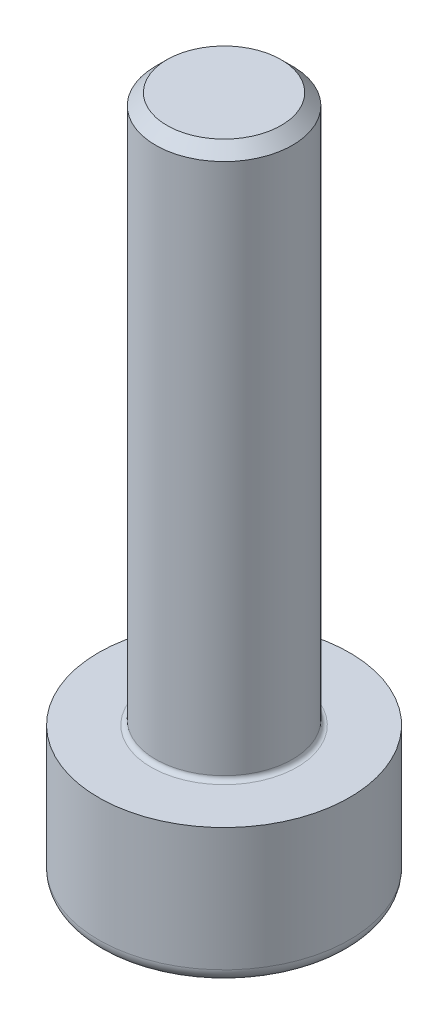
ISO-10303-21;
HEADER;
FILE_DESCRIPTION(('STEP AP214'),'2;1');
FILE_NAME('part.step','',(''),(''),'','','');
FILE_SCHEMA(('AUTOMOTIVE_DESIGN { 1 0 10303 214 1 1 1 1 }'));
ENDSEC;
DATA;
#1=APPLICATION_CONTEXT('core data for automotive mechanical design processes');
#2=APPLICATION_PROTOCOL_DEFINITION('international standard','automotive_design',2000,#1);
#3=PRODUCT_CONTEXT('',#1,'mechanical');
#4=PRODUCT('Part','Part','',(#3));
#5=PRODUCT_RELATED_PRODUCT_CATEGORY('part','',(#4));
#6=PRODUCT_DEFINITION_FORMATION('','',#4);
#7=PRODUCT_DEFINITION_CONTEXT('part definition',#1,'design');
#8=PRODUCT_DEFINITION('design','',#6,#7);
#9=PRODUCT_DEFINITION_SHAPE('','',#8);
#10=(LENGTH_UNIT() NAMED_UNIT(*) SI_UNIT(.MILLI.,.METRE.));
#11=(NAMED_UNIT(*) PLANE_ANGLE_UNIT() SI_UNIT($,.RADIAN.));
#12=(NAMED_UNIT(*) SI_UNIT($,.STERADIAN.) SOLID_ANGLE_UNIT());
#13=UNCERTAINTY_MEASURE_WITH_UNIT(LENGTH_MEASURE(1.E-05),#10,'distance_accuracy_value','');
#14=(GEOMETRIC_REPRESENTATION_CONTEXT(3) GLOBAL_UNCERTAINTY_ASSIGNED_CONTEXT((#13)) GLOBAL_UNIT_ASSIGNED_CONTEXT((#10,
#11,#12)) REPRESENTATION_CONTEXT('',''));
#15=CARTESIAN_POINT('',(0.,0.,0.));
#16=DIRECTION('',(0.,0.,1.));
#17=DIRECTION('',(1.,0.,0.));
#18=AXIS2_PLACEMENT_3D('',#15,#16,#17);
#19=CARTESIAN_POINT('',(2.45,0.,0.));
#20=DIRECTION('',(0.,1.,0.));
#21=DIRECTION('',(-1.,0.,0.));
#22=AXIS2_PLACEMENT_3D('',#19,#20,#21);
#23=PLANE('',#22);
#24=CARTESIAN_POINT('',(0.,0.,0.));
#25=DIRECTION('',(0.,-1.,0.));
#26=DIRECTION('',(-1.,0.,0.));
#27=AXIS2_PLACEMENT_3D('',#24,#25,#26);
#28=CIRCLE('',#27,2.45);
#29=CARTESIAN_POINT('',(-2.45,0.,0.));
#30=VERTEX_POINT('',#29);
#31=EDGE_CURVE('E175',#30,#30,#28,.T.);
#32=ORIENTED_EDGE('',*,*,#31,.T.);
#33=EDGE_LOOP('',(#32));
#34=FACE_BOUND('',#33,.T.);
#35=DIRECTION('',(0.,0.,-1.));
#36=VECTOR('',#35,1.);
#37=CARTESIAN_POINT('',(-1.25,0.,0.));
#38=LINE('',#37,#36);
#39=CARTESIAN_POINT('',(-1.25,0.,0.721687836487033));
#40=VERTEX_POINT('',#39);
#41=CARTESIAN_POINT('',(-1.25,0.,-0.721687836487033));
#42=VERTEX_POINT('',#41);
#43=EDGE_CURVE('E180',#40,#42,#38,.T.);
#44=ORIENTED_EDGE('',*,*,#43,.F.);
#45=DIRECTION('',(-0.866025403784439,0.,-0.5));
#46=VECTOR('',#45,1.);
#47=CARTESIAN_POINT('',(1.2125,0.,2.14341287436649));
#48=LINE('',#47,#46);
#49=CARTESIAN_POINT('',(0.,0.,1.44337567297407));
#50=VERTEX_POINT('',#49);
#51=EDGE_CURVE('E182',#50,#40,#48,.T.);
#52=ORIENTED_EDGE('',*,*,#51,.F.);
#53=DIRECTION('',(-0.866025403784439,0.,0.5));
#54=VECTOR('',#53,1.);
#55=CARTESIAN_POINT('',(2.4625,0.,0.0216506350946127));
#56=LINE('',#55,#54);
#57=CARTESIAN_POINT('',(1.25,0.,0.721687836487034));
#58=VERTEX_POINT('',#57);
#59=EDGE_CURVE('E190',#58,#50,#56,.T.);
#60=ORIENTED_EDGE('',*,*,#59,.F.);
#61=DIRECTION('',(0.,0.,1.));
#62=VECTOR('',#61,1.);
#63=CARTESIAN_POINT('',(1.25,0.,0.));
#64=LINE('',#63,#62);
#65=CARTESIAN_POINT('',(1.25,0.,-0.721687836487033));
#66=VERTEX_POINT('',#65);
#67=EDGE_CURVE('E185',#66,#58,#64,.T.);
#68=ORIENTED_EDGE('',*,*,#67,.F.);
#69=DIRECTION('',(0.866025403784439,0.,0.5));
#70=VECTOR('',#69,1.);
#71=CARTESIAN_POINT('',(2.4625,0.,-0.021650635094612));
#72=LINE('',#71,#70);
#73=CARTESIAN_POINT('',(0.,0.,-1.44337567297407));
#74=VERTEX_POINT('',#73);
#75=EDGE_CURVE('E53',#74,#66,#72,.T.);
#76=ORIENTED_EDGE('',*,*,#75,.F.);
#77=DIRECTION('',(0.866025403784439,0.,-0.5));
#78=VECTOR('',#77,1.);
#79=CARTESIAN_POINT('',(1.2125,0.,-2.14341287436649));
#80=LINE('',#79,#78);
#81=EDGE_CURVE('E11',#42,#74,#80,.T.);
#82=ORIENTED_EDGE('',*,*,#81,.F.);
#83=EDGE_LOOP('',(#44,#52,#60,#68,#76,#82));
#84=FACE_BOUND('',#83,.T.);
#85=ADVANCED_FACE('F44',(#34,#84),#23,.F.);
#86=CARTESIAN_POINT('',(0.,0.3,0.));
#87=DIRECTION('',(0.,1.,0.));
#88=DIRECTION('',(-1.,0.,0.));
#89=AXIS2_PLACEMENT_3D('',#86,#87,#88);
#90=TOROIDAL_SURFACE('',#89,2.45,0.3);
#91=CARTESIAN_POINT('',(0.,0.3,0.));
#92=DIRECTION('',(0.,-1.,0.));
#93=DIRECTION('',(-1.,0.,0.));
#94=AXIS2_PLACEMENT_3D('',#91,#92,#93);
#95=CIRCLE('',#94,2.75);
#96=CARTESIAN_POINT('',(-2.75,0.3,0.));
#97=VERTEX_POINT('',#96);
#98=EDGE_CURVE('E193',#97,#97,#95,.T.);
#99=ORIENTED_EDGE('',*,*,#98,.T.);
#100=EDGE_LOOP('',(#99));
#101=FACE_BOUND('',#100,.T.);
#102=ORIENTED_EDGE('',*,*,#31,.F.);
#103=EDGE_LOOP('',(#102));
#104=FACE_BOUND('',#103,.T.);
#105=ADVANCED_FACE('F164',(#101,#104),#90,.T.);
#106=CARTESIAN_POINT('',(0.,2.57168783648703,0.));
#107=DIRECTION('',(0.,1.,0.));
#108=DIRECTION('',(-1.,0.,0.));
#109=AXIS2_PLACEMENT_3D('',#106,#107,#108);
#110=CYLINDRICAL_SURFACE('',#109,2.75);
#111=CARTESIAN_POINT('',(0.,3.,0.));
#112=DIRECTION('',(0.,-1.,0.));
#113=DIRECTION('',(-1.,0.,0.));
#114=AXIS2_PLACEMENT_3D('',#111,#112,#113);
#115=CIRCLE('',#114,2.75);
#116=CARTESIAN_POINT('',(-2.75,3.,0.));
#117=VERTEX_POINT('',#116);
#118=EDGE_CURVE('E196',#117,#117,#115,.T.);
#119=ORIENTED_EDGE('',*,*,#118,.T.);
#120=EDGE_LOOP('',(#119));
#121=FACE_BOUND('',#120,.T.);
#122=ORIENTED_EDGE('',*,*,#98,.F.);
#123=EDGE_LOOP('',(#122));
#124=FACE_BOUND('',#123,.T.);
#125=ADVANCED_FACE('F160',(#121,#124),#110,.T.);
#126=CARTESIAN_POINT('',(1.6,3.,0.));
#127=DIRECTION('',(0.,-1.,0.));
#128=DIRECTION('',(1.,0.,0.));
#129=AXIS2_PLACEMENT_3D('',#126,#127,#128);
#130=PLANE('',#129);
#131=CARTESIAN_POINT('',(0.,3.,0.));
#132=DIRECTION('',(0.,-1.,0.));
#133=DIRECTION('',(-1.,0.,0.));
#134=AXIS2_PLACEMENT_3D('',#131,#132,#133);
#135=CIRCLE('',#134,1.6);
#136=CARTESIAN_POINT('',(-1.6,3.,0.));
#137=VERTEX_POINT('',#136);
#138=EDGE_CURVE('E199',#137,#137,#135,.T.);
#139=ORIENTED_EDGE('',*,*,#138,.T.);
#140=EDGE_LOOP('',(#139));
#141=FACE_BOUND('',#140,.T.);
#142=ORIENTED_EDGE('',*,*,#118,.F.);
#143=EDGE_LOOP('',(#142));
#144=FACE_BOUND('',#143,.T.);
#145=ADVANCED_FACE('F156',(#141,#144),#130,.F.);
#146=CARTESIAN_POINT('',(0.,3.1,0.));
#147=DIRECTION('',(0.,1.,0.));
#148=DIRECTION('',(-1.,0.,0.));
#149=AXIS2_PLACEMENT_3D('',#146,#147,#148);
#150=TOROIDAL_SURFACE('',#149,1.6,0.099999999999999);
#151=CARTESIAN_POINT('',(0.,3.1,0.));
#152=DIRECTION('',(0.,-1.,0.));
#153=DIRECTION('',(-1.,0.,0.));
#154=AXIS2_PLACEMENT_3D('',#151,#152,#153);
#155=CIRCLE('',#154,1.5);
#156=CARTESIAN_POINT('',(-1.5,3.1,0.));
#157=VERTEX_POINT('',#156);
#158=EDGE_CURVE('E202',#157,#157,#155,.T.);
#159=ORIENTED_EDGE('',*,*,#158,.T.);
#160=EDGE_LOOP('',(#159));
#161=FACE_BOUND('',#160,.T.);
#162=ORIENTED_EDGE('',*,*,#138,.F.);
#163=EDGE_LOOP('',(#162));
#164=FACE_BOUND('',#163,.T.);
#165=ADVANCED_FACE('F152',(#161,#164),#150,.F.);
#166=CARTESIAN_POINT('',(0.,2.57168783648703,0.));
#167=DIRECTION('',(0.,1.,0.));
#168=DIRECTION('',(-1.,0.,0.));
#169=AXIS2_PLACEMENT_3D('',#166,#167,#168);
#170=CYLINDRICAL_SURFACE('',#169,1.5);
#171=CARTESIAN_POINT('',(0.,14.75,0.));
#172=DIRECTION('',(0.,-1.,0.));
#173=DIRECTION('',(-1.,0.,0.));
#174=AXIS2_PLACEMENT_3D('',#171,#172,#173);
#175=CIRCLE('',#174,1.5);
#176=CARTESIAN_POINT('',(-1.5,14.75,0.));
#177=VERTEX_POINT('',#176);
#178=EDGE_CURVE('E205',#177,#177,#175,.T.);
#179=ORIENTED_EDGE('',*,*,#178,.T.);
#180=EDGE_LOOP('',(#179));
#181=FACE_BOUND('',#180,.T.);
#182=ORIENTED_EDGE('',*,*,#158,.F.);
#183=EDGE_LOOP('',(#182));
#184=FACE_BOUND('',#183,.T.);
#185=ADVANCED_FACE('F148',(#181,#184),#170,.T.);
#186=CARTESIAN_POINT('',(0.,14.75,0.));
#187=DIRECTION('',(0.,-1.,0.));
#188=DIRECTION('',(1.,0.,0.));
#189=AXIS2_PLACEMENT_3D('',#186,#187,#188);
#190=CONICAL_SURFACE('',#189,1.5,0.785398163397447);
#191=CARTESIAN_POINT('',(0.,15.,0.));
#192=DIRECTION('',(0.,-1.,0.));
#193=DIRECTION('',(-1.,0.,0.));
#194=AXIS2_PLACEMENT_3D('',#191,#192,#193);
#195=CIRCLE('',#194,1.25);
#196=CARTESIAN_POINT('',(-1.25,15.,0.));
#197=VERTEX_POINT('',#196);
#198=EDGE_CURVE('E208',#197,#197,#195,.T.);
#199=ORIENTED_EDGE('',*,*,#198,.T.);
#200=EDGE_LOOP('',(#199));
#201=FACE_BOUND('',#200,.T.);
#202=ORIENTED_EDGE('',*,*,#178,.F.);
#203=EDGE_LOOP('',(#202));
#204=FACE_BOUND('',#203,.T.);
#205=ADVANCED_FACE('F144',(#201,#204),#190,.T.);
#206=CARTESIAN_POINT('',(0.,15.,0.));
#207=DIRECTION('',(0.,-1.,0.));
#208=DIRECTION('',(1.,0.,0.));
#209=AXIS2_PLACEMENT_3D('',#206,#207,#208);
#210=PLANE('',#209);
#211=ORIENTED_EDGE('',*,*,#198,.F.);
#212=EDGE_LOOP('',(#211));
#213=FACE_BOUND('',#212,.T.);
#214=ADVANCED_FACE('F139',(#213),#210,.F.);
#215=CARTESIAN_POINT('',(1.25,15.001,0.721687836487034));
#216=DIRECTION('',(1.,0.,0.));
#217=DIRECTION('',(0.,0.,1.));
#218=AXIS2_PLACEMENT_3D('',#215,#216,#217);
#219=PLANE('',#218);
#220=CARTESIAN_POINT('',(1.25,1.22644580862981,1.96634898747406));
#221=CARTESIAN_POINT('',(1.25,1.25317146219852,1.91148378854413));
#222=CARTESIAN_POINT('',(1.25,1.2796480285554,1.85649545080559));
#223=CARTESIAN_POINT('',(1.25,1.3319649674294,1.7462072516911));
#224=CARTESIAN_POINT('',(1.25,1.35780524459231,1.69090734513106));
#225=CARTESIAN_POINT('',(1.25,1.4088355139196,1.57965936326713));
#226=CARTESIAN_POINT('',(1.25,1.43402143890061,1.52370941384165));
#227=CARTESIAN_POINT('',(1.25,1.48339304136398,1.41137315660425));
#228=CARTESIAN_POINT('',(1.25,1.50757876450185,1.35498686884934));
#229=CARTESIAN_POINT('',(1.25,1.57982512890039,1.18132779523945));
#230=CARTESIAN_POINT('',(1.25,1.62586428184677,1.06320038599232));
#231=CARTESIAN_POINT('',(1.25,1.70906475040286,0.823976834049391));
#232=CARTESIAN_POINT('',(1.25,1.7462456223794,0.70288789412274));
#233=CARTESIAN_POINT('',(1.25,1.79094524453186,0.51886755493118));
#234=CARTESIAN_POINT('',(1.25,1.80398004287685,0.457294016373166));
#235=CARTESIAN_POINT('',(1.25,1.82555714754675,0.333351830610552));
#236=CARTESIAN_POINT('',(1.25,1.83409998794023,0.27098327883208));
#237=CARTESIAN_POINT('',(1.25,1.84590477816891,0.146586081476386));
#238=CARTESIAN_POINT('',(1.25,1.84923660926268,0.084564252788793));
#239=CARTESIAN_POINT('',(1.25,1.85052929618531,-0.0395366710055276));
#240=CARTESIAN_POINT('',(1.25,1.84848992817905,-0.101615768391054));
#241=CARTESIAN_POINT('',(1.25,1.83745961567824,-0.248814169138213));
#242=CARTESIAN_POINT('',(1.25,1.82612933862852,-0.33375915810721));
#243=CARTESIAN_POINT('',(1.25,1.7953184933172,-0.502179342148273));
#244=CARTESIAN_POINT('',(1.25,1.77582917687708,-0.585652859086516));
#245=CARTESIAN_POINT('',(1.25,1.74180711198623,-0.710631739553223));
#246=CARTESIAN_POINT('',(1.25,1.72948747231231,-0.752765091259072));
#247=CARTESIAN_POINT('',(1.25,1.70352113916922,-0.83659530045168));
#248=CARTESIAN_POINT('',(1.25,1.6898752262336,-0.878292398865865));
#249=CARTESIAN_POINT('',(1.25,1.66147120615486,-0.961301686065083));
#250=CARTESIAN_POINT('',(1.25,1.64671313334558,-1.00261388668821));
#251=CARTESIAN_POINT('',(1.25,1.61626323194121,-1.08489771065719));
#252=CARTESIAN_POINT('',(1.25,1.60057127765747,-1.12586928730981));
#253=CARTESIAN_POINT('',(1.25,1.54674137764618,-1.26252996281167));
#254=CARTESIAN_POINT('',(1.25,1.50685907587367,-1.35753167600178));
#255=CARTESIAN_POINT('',(1.25,1.4242597796916,-1.54630039074075));
#256=CARTESIAN_POINT('',(1.25,1.38154213370329,-1.64006710250442));
#257=CARTESIAN_POINT('',(1.25,1.29412743576656,-1.8267354934722));
#258=CARTESIAN_POINT('',(1.25,1.24942925990683,-1.91963664434324));
#259=CARTESIAN_POINT('',(1.25,1.1586378419371,-2.10475634551476));
#260=CARTESIAN_POINT('',(1.25,1.11254453900757,-2.19697486583774));
#261=CARTESIAN_POINT('',(1.25,0.97253920737547,-2.47330326122855));
#262=CARTESIAN_POINT('',(1.25,0.877113426737367,-2.65664454094219));
#263=CARTESIAN_POINT('',(1.25,0.684015252311146,-3.02204198462106));
#264=CARTESIAN_POINT('',(1.25,0.586343711538339,-3.20409860329431));
#265=CARTESIAN_POINT('',(1.25,0.40393555500273,-3.54087867644216));
#266=CARTESIAN_POINT('',(1.25,0.319394691562984,-3.69570826723714));
#267=CARTESIAN_POINT('',(1.25,0.149562599723357,-4.00497752173039));
#268=CARTESIAN_POINT('',(1.25,0.064271287544673,-4.1594171393509));
#269=CARTESIAN_POINT('',(1.25,-0.106473142461991,-4.4673228515578));
#270=CARTESIAN_POINT('',(1.25,-0.191923915614537,-4.62079024746718));
#271=CARTESIAN_POINT('',(1.25,-0.363221852324531,-4.92747869775711));
#272=CARTESIAN_POINT('',(1.25,-0.449068965280437,-5.08069978039172));
#273=CARTESIAN_POINT('',(1.25,-0.535057170488759,-5.23384119123874));
#274=B_SPLINE_CURVE_WITH_KNOTS('',3,(#220,#221,#222,#223,#224,#225,#226,#227,#228,#229,#230,
#231,#232,#233,#234,#235,#236,#237,#238,#239,#240,#241,#242,#243,#244,#245,#246,#247,#248,#249,
#250,#251,#252,#253,#254,#255,#256,#257,#258,#259,#260,#261,#262,#263,#264,#265,#266,#267,#268,
#269,#270,#271,#272,#273),.UNSPECIFIED.,.F.,.F.,(4,2,2,2,2,2,2,2,2,2,2,2,2,2,2,2,2,2,2,2,2,2,2,
2,2,2,4),(0.,0.183086522072901,0.366200316511046,0.550263707495385,0.734318687373647,
1.11450020043434,1.49383444626733,1.682515563593,1.87117424271846,2.05728056906829,
2.2433946511888,2.49996410929789,2.75680937038745,2.88848504146508,3.02008368316105,
3.15167826389845,3.28329059583557,3.59230924344663,3.90139915289052,4.2106667692432,
4.51994788735812,5.13997840471392,5.75977718199721,6.28899455758078,6.81827178326328,
7.34523094703629,7.87212459722161),.UNSPECIFIED.);
#275=CARTESIAN_POINT('',(1.25,1.73835450315374,0.721687836487098));
#276=VERTEX_POINT('',#275);
#277=CARTESIAN_POINT('',(1.25,1.7383545031537,-0.721687836487033));
#278=VERTEX_POINT('',#277);
#279=EDGE_CURVE('E103',#276,#278,#274,.T.);
#280=ORIENTED_EDGE('',*,*,#279,.T.);
#281=DIRECTION('',(0.,-1.,0.));
#282=VECTOR('',#281,1.);
#283=CARTESIAN_POINT('',(1.25,15.001,-0.721687836487033));
#284=LINE('',#283,#282);
#285=EDGE_CURVE('E109',#278,#66,#284,.T.);
#286=ORIENTED_EDGE('',*,*,#285,.T.);
#287=ORIENTED_EDGE('',*,*,#67,.T.);
#288=DIRECTION('',(0.,-1.,0.));
#289=VECTOR('',#288,1.);
#290=CARTESIAN_POINT('',(1.25,15.001,0.721687836487034));
#291=LINE('',#290,#289);
#292=EDGE_CURVE('E120',#276,#58,#291,.T.);
#293=ORIENTED_EDGE('',*,*,#292,.F.);
#294=EDGE_LOOP('',(#280,#286,#287,#293));
#295=FACE_BOUND('',#294,.T.);
#296=ADVANCED_FACE('F119',(#295),#219,.F.);
#297=CARTESIAN_POINT('',(1.25,15.001,-0.721687836487033));
#298=DIRECTION('',(0.5,0.,-0.866025403784438));
#299=DIRECTION('',(0.866025403784439,0.,0.5));
#300=AXIS2_PLACEMENT_3D('',#297,#298,#299);
#301=PLANE('',#300);
#302=CARTESIAN_POINT('',(1.2502,1.73828782848767,-0.721572366433196));
#303=CARTESIAN_POINT('',(1.19526669476824,1.75660858839001,-0.753288124996231));
#304=CARTESIAN_POINT('',(1.13985921349976,1.77327119695306,-0.785277649221704));
#305=CARTESIAN_POINT('',(1.02808463239966,1.80235719920793,-0.849810733708405));
#306=CARTESIAN_POINT('',(0.97171554515829,1.81477030117765,-0.882355441401183));
#307=CARTESIAN_POINT('',(0.859676025913016,1.83409481551769,-0.947041487997319));
#308=CARTESIAN_POINT('',(0.804022841540771,1.84113481370627,-0.979172868975894));
#309=CARTESIAN_POINT('',(0.692454346091609,1.84954207052307,-1.04358696985655));
#310=CARTESIAN_POINT('',(0.6365394410624,1.85091628794897,-1.07586945532688));
#311=CARTESIAN_POINT('',(0.532042078818275,1.84807116578578,-1.13620103554813));
#312=CARTESIAN_POINT('',(0.483444050118685,1.84455040433368,-1.16425912049992));
#313=CARTESIAN_POINT('',(0.386564637826762,1.83338739045444,-1.22019247526559));
#314=CARTESIAN_POINT('',(0.338283589807837,1.82574131758102,-1.24806755133608));
#315=CARTESIAN_POINT('',(0.241204116145957,1.80662504845317,-1.30411641158755));
#316=CARTESIAN_POINT('',(0.192417989648101,1.79507374617404,-1.33228309485381));
#317=CARTESIAN_POINT('',(0.095573747707898,1.76885618845981,-1.38819614400745));
#318=CARTESIAN_POINT('',(0.0475143896730359,1.75419610101459,-1.41594322730596));
#319=CARTESIAN_POINT('',(-0.000199999999999981,1.73828782848767,-1.4434911430279));
#320=B_SPLINE_CURVE_WITH_KNOTS('',3,(#302,#303,#304,#305,#306,#307,#308,#309,#310,#311,#312,
#313,#314,#315,#316,#317,#318,#319),.UNSPECIFIED.,.F.,.F.,(4,2,2,2,2,2,2,2,4),(0.,
0.198150821029559,0.396778196315221,0.5904886173544,0.783961049317182,0.952480056398646,
1.1211553973001,1.2935743034359,1.4656542697693),.UNSPECIFIED.);
#321=CARTESIAN_POINT('',(0.,1.7383545031537,-1.44337567297407));
#322=VERTEX_POINT('',#321);
#323=EDGE_CURVE('E100',#278,#322,#320,.T.);
#324=ORIENTED_EDGE('',*,*,#323,.T.);
#325=DIRECTION('',(0.,-1.,0.));
#326=VECTOR('',#325,1.);
#327=CARTESIAN_POINT('',(0.,15.001,-1.44337567297407));
#328=LINE('',#327,#326);
#329=EDGE_CURVE('E108',#322,#74,#328,.T.);
#330=ORIENTED_EDGE('',*,*,#329,.T.);
#331=ORIENTED_EDGE('',*,*,#75,.T.);
#332=ORIENTED_EDGE('',*,*,#285,.F.);
#333=EDGE_LOOP('',(#324,#330,#331,#332));
#334=FACE_BOUND('',#333,.T.);
#335=ADVANCED_FACE('F112',(#334),#301,.F.);
#336=CARTESIAN_POINT('',(0.,15.001,-1.44337567297407));
#337=DIRECTION('',(-0.5,0.,-0.866025403784439));
#338=DIRECTION('',(0.866025403784439,0.,-0.5));
#339=AXIS2_PLACEMENT_3D('',#336,#337,#338);
#340=PLANE('',#339);
#341=CARTESIAN_POINT('',(0.000199999999999973,1.73828782848767,-1.4434911430279));
#342=CARTESIAN_POINT('',(-0.0547333052317652,1.75660858839001,-1.41177538446487));
#343=CARTESIAN_POINT('',(-0.11014078650024,1.77327119695306,-1.3797858602394));
#344=CARTESIAN_POINT('',(-0.22191536760034,1.80235719920793,-1.3152527757527));
#345=CARTESIAN_POINT('',(-0.278284454841711,1.81477030117765,-1.28270806805992));
#346=CARTESIAN_POINT('',(-0.390323974086985,1.83409481551769,-1.21802202146378));
#347=CARTESIAN_POINT('',(-0.44597715845923,1.84113481370627,-1.18589064048521));
#348=CARTESIAN_POINT('',(-0.557545653908392,1.84954207052307,-1.12147653960455));
#349=CARTESIAN_POINT('',(-0.613460558937601,1.85091628794897,-1.08919405413422));
#350=CARTESIAN_POINT('',(-0.717957921181725,1.84807116578578,-1.02886247391297));
#351=CARTESIAN_POINT('',(-0.766555949881316,1.84455040433368,-1.00080438896118));
#352=CARTESIAN_POINT('',(-0.863435362173239,1.83338739045444,-0.944871034195505));
#353=CARTESIAN_POINT('',(-0.911716410192164,1.82574131758102,-0.916995958125021));
#354=CARTESIAN_POINT('',(-1.00879588385404,1.80662504845317,-0.860947097873548));
#355=CARTESIAN_POINT('',(-1.0575820103519,1.79507374617404,-0.832780414607291));
#356=CARTESIAN_POINT('',(-1.1544262522921,1.76885618845981,-0.77686736545365));
#357=CARTESIAN_POINT('',(-1.20248561032697,1.75419610101459,-0.749120282155141));
#358=CARTESIAN_POINT('',(-1.2502,1.73828782848767,-0.721572366433196));
#359=B_SPLINE_CURVE_WITH_KNOTS('',3,(#341,#342,#343,#344,#345,#346,#347,#348,#349,#350,#351,
#352,#353,#354,#355,#356,#357,#358),.UNSPECIFIED.,.F.,.F.,(4,2,2,2,2,2,2,2,4),(0.,
0.19815082102956,0.396778196315221,0.5904886173544,0.783961049317182,0.952480056398647,
1.1211553973001,1.2935743034359,1.4656542697693),.UNSPECIFIED.);
#360=CARTESIAN_POINT('',(-1.25,1.7383545031537,-0.721687836487033));
#361=VERTEX_POINT('',#360);
#362=EDGE_CURVE('E105',#322,#361,#359,.T.);
#363=ORIENTED_EDGE('',*,*,#362,.T.);
#364=DIRECTION('',(0.,-1.,0.));
#365=VECTOR('',#364,1.);
#366=CARTESIAN_POINT('',(-1.25,15.001,-0.721687836487033));
#367=LINE('',#366,#365);
#368=EDGE_CURVE('E213',#361,#42,#367,.T.);
#369=ORIENTED_EDGE('',*,*,#368,.T.);
#370=ORIENTED_EDGE('',*,*,#81,.T.);
#371=ORIENTED_EDGE('',*,*,#329,.F.);
#372=EDGE_LOOP('',(#363,#369,#370,#371));
#373=FACE_BOUND('',#372,.T.);
#374=ADVANCED_FACE('F234',(#373),#340,.F.);
#375=CARTESIAN_POINT('',(-1.25,15.001,-0.721687836487033));
#376=DIRECTION('',(-1.,0.,0.));
#377=DIRECTION('',(0.,0.,-1.));
#378=AXIS2_PLACEMENT_3D('',#375,#376,#377);
#379=PLANE('',#378);
#380=CARTESIAN_POINT('',(-1.25,1.22644580862981,1.96634898747406));
#381=CARTESIAN_POINT('',(-1.25,1.25317146219852,1.91148378854413));
#382=CARTESIAN_POINT('',(-1.25,1.2796480285554,1.85649545080559));
#383=CARTESIAN_POINT('',(-1.25,1.3319649674294,1.7462072516911));
#384=CARTESIAN_POINT('',(-1.25,1.35780524459231,1.69090734513106));
#385=CARTESIAN_POINT('',(-1.25,1.4088355139196,1.57965936326713));
#386=CARTESIAN_POINT('',(-1.25,1.43402143890061,1.52370941384165));
#387=CARTESIAN_POINT('',(-1.25,1.48339304136398,1.41137315660425));
#388=CARTESIAN_POINT('',(-1.25,1.50757876450185,1.35498686884934));
#389=CARTESIAN_POINT('',(-1.25,1.57982512890039,1.18132779523945));
#390=CARTESIAN_POINT('',(-1.25,1.62586428184677,1.06320038599232));
#391=CARTESIAN_POINT('',(-1.25,1.70906475040286,0.823976834049391));
#392=CARTESIAN_POINT('',(-1.25,1.7462456223794,0.702887894122739));
#393=CARTESIAN_POINT('',(-1.25,1.79094524453186,0.518867554931179));
#394=CARTESIAN_POINT('',(-1.25,1.80398004287685,0.457294016373165));
#395=CARTESIAN_POINT('',(-1.25,1.82555714754675,0.333351830610551));
#396=CARTESIAN_POINT('',(-1.25,1.83409998794023,0.270983278832079));
#397=CARTESIAN_POINT('',(-1.25,1.84590477816891,0.146586081476385));
#398=CARTESIAN_POINT('',(-1.25,1.84923660926268,0.0845642527887915));
#399=CARTESIAN_POINT('',(-1.25,1.85052929618531,-0.0395366710055291));
#400=CARTESIAN_POINT('',(-1.25,1.84848992817905,-0.101615768391055));
#401=CARTESIAN_POINT('',(-1.25,1.83745961567824,-0.248814169138215));
#402=CARTESIAN_POINT('',(-1.25,1.82612933862852,-0.333759158107211));
#403=CARTESIAN_POINT('',(-1.25,1.7953184933172,-0.502179342148275));
#404=CARTESIAN_POINT('',(-1.25,1.77582917687707,-0.585652859086518));
#405=CARTESIAN_POINT('',(-1.25,1.74180711198623,-0.710631739553225));
#406=CARTESIAN_POINT('',(-1.25,1.72948747231231,-0.752765091259075));
#407=CARTESIAN_POINT('',(-1.25,1.70352113916922,-0.836595300451682));
#408=CARTESIAN_POINT('',(-1.25,1.6898752262336,-0.878292398865867));
#409=CARTESIAN_POINT('',(-1.25,1.66147120615486,-0.961301686065086));
#410=CARTESIAN_POINT('',(-1.25,1.64671313334558,-1.00261388668821));
#411=CARTESIAN_POINT('',(-1.25,1.61626323194121,-1.0848977106572));
#412=CARTESIAN_POINT('',(-1.25,1.60057127765747,-1.12586928730981));
#413=CARTESIAN_POINT('',(-1.25,1.54674137764618,-1.26252996281167));
#414=CARTESIAN_POINT('',(-1.25,1.50685907587367,-1.35753167600179));
#415=CARTESIAN_POINT('',(-1.25,1.4242597796916,-1.54630039074075));
#416=CARTESIAN_POINT('',(-1.25,1.38154213370329,-1.64006710250443));
#417=CARTESIAN_POINT('',(-1.25,1.29412743576656,-1.8267354934722));
#418=CARTESIAN_POINT('',(-1.25,1.24942925990683,-1.91963664434324));
#419=CARTESIAN_POINT('',(-1.25,1.15863784193709,-2.10475634551477));
#420=CARTESIAN_POINT('',(-1.25,1.11254453900757,-2.19697486583775));
#421=CARTESIAN_POINT('',(-1.25,0.972539207375465,-2.47330326122856));
#422=CARTESIAN_POINT('',(-1.25,0.877113426737362,-2.6566445409422));
#423=CARTESIAN_POINT('',(-1.25,0.684015252311141,-3.02204198462107));
#424=CARTESIAN_POINT('',(-1.25,0.586343711538334,-3.20409860329432));
#425=CARTESIAN_POINT('',(-1.25,0.403935555002724,-3.54087867644217));
#426=CARTESIAN_POINT('',(-1.25,0.319394691562978,-3.69570826723715));
#427=CARTESIAN_POINT('',(-1.25,0.14956259972335,-4.0049775217304));
#428=CARTESIAN_POINT('',(-1.25,0.0642712875446668,-4.15941713935091));
#429=CARTESIAN_POINT('',(-1.25,-0.106473142461998,-4.46732285155781));
#430=CARTESIAN_POINT('',(-1.25,-0.191923915614544,-4.6207902474672));
#431=CARTESIAN_POINT('',(-1.25,-0.363221852324537,-4.92747869775712));
#432=CARTESIAN_POINT('',(-1.25,-0.449068965280443,-5.08069978039173));
#433=CARTESIAN_POINT('',(-1.25,-0.535057170488765,-5.23384119123875));
#434=B_SPLINE_CURVE_WITH_KNOTS('',3,(#380,#381,#382,#383,#384,#385,#386,#387,#388,#389,#390,
#391,#392,#393,#394,#395,#396,#397,#398,#399,#400,#401,#402,#403,#404,#405,#406,#407,#408,#409,
#410,#411,#412,#413,#414,#415,#416,#417,#418,#419,#420,#421,#422,#423,#424,#425,#426,#427,#428,
#429,#430,#431,#432,#433),.UNSPECIFIED.,.F.,.F.,(4,2,2,2,2,2,2,2,2,2,2,2,2,2,2,2,2,2,2,2,2,2,2,
2,2,2,4),(0.,0.183086522072901,0.366200316511047,0.550263707495385,0.734318687373648,
1.11450020043434,1.49383444626733,1.682515563593,1.87117424271846,2.05728056906829,
2.2433946511888,2.49996410929789,2.75680937038745,2.88848504146508,3.02008368316105,
3.15167826389845,3.28329059583557,3.59230924344664,3.90139915289052,4.2106667692432,
4.51994788735813,5.13997840471393,5.75977718199722,6.28899455758079,6.81827178326329,
7.3452309470363,7.87212459722162),.UNSPECIFIED.);
#435=CARTESIAN_POINT('',(-1.25,1.73835450315374,0.721687836487097));
#436=VERTEX_POINT('',#435);
#437=EDGE_CURVE('E215',#361,#436,#434,.F.);
#438=ORIENTED_EDGE('',*,*,#437,.T.);
#439=DIRECTION('',(0.,-1.,0.));
#440=VECTOR('',#439,1.);
#441=CARTESIAN_POINT('',(-1.25,15.001,0.721687836487033));
#442=LINE('',#441,#440);
#443=EDGE_CURVE('E216',#436,#40,#442,.T.);
#444=ORIENTED_EDGE('',*,*,#443,.T.);
#445=ORIENTED_EDGE('',*,*,#43,.T.);
#446=ORIENTED_EDGE('',*,*,#368,.F.);
#447=EDGE_LOOP('',(#438,#444,#445,#446));
#448=FACE_BOUND('',#447,.T.);
#449=ADVANCED_FACE('F237',(#448),#379,.F.);
#450=CARTESIAN_POINT('',(-1.25,15.001,0.721687836487033));
#451=DIRECTION('',(-0.5,0.,0.866025403784439));
#452=DIRECTION('',(-0.866025403784439,0.,-0.5));
#453=AXIS2_PLACEMENT_3D('',#450,#451,#452);
#454=PLANE('',#453);
#455=CARTESIAN_POINT('',(-1.2502,1.73828782848767,0.721572366433195));
#456=CARTESIAN_POINT('',(-1.19526669476824,1.75660858839001,0.75328812499623));
#457=CARTESIAN_POINT('',(-1.13985921349976,1.77327119695306,0.785277649221703));
#458=CARTESIAN_POINT('',(-1.02808463239966,1.80235719920793,0.849810733708404));
#459=CARTESIAN_POINT('',(-0.971715545158291,1.81477030117765,0.882355441401183));
#460=CARTESIAN_POINT('',(-0.859676025913016,1.83409481551769,0.947041487997318));
#461=CARTESIAN_POINT('',(-0.804022841540771,1.84113481370627,0.979172868975893));
#462=CARTESIAN_POINT('',(-0.692454346091609,1.84954207052307,1.04358696985655));
#463=CARTESIAN_POINT('',(-0.636539441062401,1.85091628794898,1.07586945532687));
#464=CARTESIAN_POINT('',(-0.532042078818276,1.84807116578578,1.13620103554813));
#465=CARTESIAN_POINT('',(-0.483444050118685,1.84455040433368,1.16425912049992));
#466=CARTESIAN_POINT('',(-0.386564637826762,1.83338739045444,1.22019247526559));
#467=CARTESIAN_POINT('',(-0.338283589807837,1.82574131758102,1.24806755133608));
#468=CARTESIAN_POINT('',(-0.241204116145957,1.80662504845317,1.30411641158755));
#469=CARTESIAN_POINT('',(-0.192417989648101,1.79507374617404,1.33228309485381));
#470=CARTESIAN_POINT('',(-0.0955737477078979,1.76885618845981,1.38819614400745));
#471=CARTESIAN_POINT('',(-0.0475143896730357,1.75419610101459,1.41594322730596));
#472=CARTESIAN_POINT('',(0.000200000000000027,1.73828782848767,1.4434911430279));
#473=B_SPLINE_CURVE_WITH_KNOTS('',3,(#455,#456,#457,#458,#459,#460,#461,#462,#463,#464,#465,
#466,#467,#468,#469,#470,#471,#472),.UNSPECIFIED.,.F.,.F.,(4,2,2,2,2,2,2,2,4),(0.,
0.198150821029559,0.396778196315221,0.5904886173544,0.783961049317182,0.952480056398646,
1.1211553973001,1.2935743034359,1.4656542697693),.UNSPECIFIED.);
#474=CARTESIAN_POINT('',(0.,1.7383545031537,1.44337567297407));
#475=VERTEX_POINT('',#474);
#476=EDGE_CURVE('E218',#436,#475,#473,.T.);
#477=ORIENTED_EDGE('',*,*,#476,.T.);
#478=DIRECTION('',(0.,-1.,0.));
#479=VECTOR('',#478,1.);
#480=CARTESIAN_POINT('',(0.,15.001,1.44337567297407));
#481=LINE('',#480,#479);
#482=EDGE_CURVE('E60',#475,#50,#481,.T.);
#483=ORIENTED_EDGE('',*,*,#482,.T.);
#484=ORIENTED_EDGE('',*,*,#51,.T.);
#485=ORIENTED_EDGE('',*,*,#443,.F.);
#486=EDGE_LOOP('',(#477,#483,#484,#485));
#487=FACE_BOUND('',#486,.T.);
#488=ADVANCED_FACE('F242',(#487),#454,.F.);
#489=CARTESIAN_POINT('',(0.,15.001,1.44337567297407));
#490=DIRECTION('',(0.5,0.,0.866025403784439));
#491=DIRECTION('',(-0.866025403784439,0.,0.5));
#492=AXIS2_PLACEMENT_3D('',#489,#490,#491);
#493=PLANE('',#492);
#494=CARTESIAN_POINT('',(-0.000199999999999952,1.73828782848767,1.4434911430279));
#495=CARTESIAN_POINT('',(0.0547333052317652,1.75660858839001,1.41177538446487));
#496=CARTESIAN_POINT('',(0.11014078650024,1.77327119695306,1.3797858602394));
#497=CARTESIAN_POINT('',(0.22191536760034,1.80235719920793,1.31525277575269));
#498=CARTESIAN_POINT('',(0.27828445484171,1.81477030117765,1.28270806805992));
#499=CARTESIAN_POINT('',(0.390323974086985,1.83409481551769,1.21802202146378));
#500=CARTESIAN_POINT('',(0.44597715845923,1.84113481370627,1.18589064048521));
#501=CARTESIAN_POINT('',(0.557545653908392,1.84954207052307,1.12147653960455));
#502=CARTESIAN_POINT('',(0.613460558937601,1.85091628794897,1.08919405413422));
#503=CARTESIAN_POINT('',(0.717957921181725,1.84807116578578,1.02886247391297));
#504=CARTESIAN_POINT('',(0.766555949881316,1.84455040433368,1.00080438896118));
#505=CARTESIAN_POINT('',(0.863435362173238,1.83338739045444,0.944871034195505));
#506=CARTESIAN_POINT('',(0.911716410192163,1.82574131758102,0.916995958125021));
#507=CARTESIAN_POINT('',(1.00879588385404,1.80662504845317,0.860947097873548));
#508=CARTESIAN_POINT('',(1.0575820103519,1.79507374617404,0.832780414607291));
#509=CARTESIAN_POINT('',(1.1544262522921,1.76885618845981,0.77686736545365));
#510=CARTESIAN_POINT('',(1.20248561032696,1.75419610101459,0.749120282155142));
#511=CARTESIAN_POINT('',(1.2502,1.73828782848767,0.721572366433196));
#512=B_SPLINE_CURVE_WITH_KNOTS('',3,(#494,#495,#496,#497,#498,#499,#500,#501,#502,#503,#504,
#505,#506,#507,#508,#509,#510,#511),.UNSPECIFIED.,.F.,.F.,(4,2,2,2,2,2,2,2,4),(0.,
0.198150821029559,0.396778196315221,0.5904886173544,0.783961049317182,0.952480056398646,
1.1211553973001,1.2935743034359,1.4656542697693),.UNSPECIFIED.);
#513=EDGE_CURVE('E128',#475,#276,#512,.T.);
#514=ORIENTED_EDGE('',*,*,#513,.T.);
#515=ORIENTED_EDGE('',*,*,#292,.T.);
#516=ORIENTED_EDGE('',*,*,#59,.T.);
#517=ORIENTED_EDGE('',*,*,#482,.F.);
#518=EDGE_LOOP('',(#514,#515,#516,#517));
#519=FACE_BOUND('',#518,.T.);
#520=ADVANCED_FACE('F245',(#519),#493,.F.);
#521=CARTESIAN_POINT('',(0.,2.57168783648703,0.));
#522=DIRECTION('',(0.,-1.,0.));
#523=DIRECTION('',(1.,0.,0.));
#524=AXIS2_PLACEMENT_3D('',#521,#522,#523);
#525=CONICAL_SURFACE('',#524,0.,1.0471975511966);
#526=ORIENTED_EDGE('',*,*,#279,.F.);
#527=ORIENTED_EDGE('',*,*,#513,.F.);
#528=ORIENTED_EDGE('',*,*,#476,.F.);
#529=ORIENTED_EDGE('',*,*,#437,.F.);
#530=ORIENTED_EDGE('',*,*,#362,.F.);
#531=ORIENTED_EDGE('',*,*,#323,.F.);
#532=EDGE_LOOP('',(#526,#527,#528,#529,#530,#531));
#533=FACE_BOUND('',#532,.T.);
#534=CARTESIAN_POINT('',(0.,2.57168783648703,0.));
#535=VERTEX_POINT('',#534);
#536=VERTEX_LOOP('',#535);
#537=FACE_BOUND('',#536,.T.);
#538=ADVANCED_FACE('F46',(#533,#537),#525,.F.);
#539=CLOSED_SHELL('',(#85,#105,#125,#145,#165,#185,#205,#214,#296,#335,#374,#449,#488,#520,#538));
#540=MANIFOLD_SOLID_BREP('B2',#539);
#541=ADVANCED_BREP_SHAPE_REPRESENTATION('',(#18,#540),#14);
#542=SHAPE_DEFINITION_REPRESENTATION(#9,#541);
ENDSEC;
END-ISO-10303-21;
